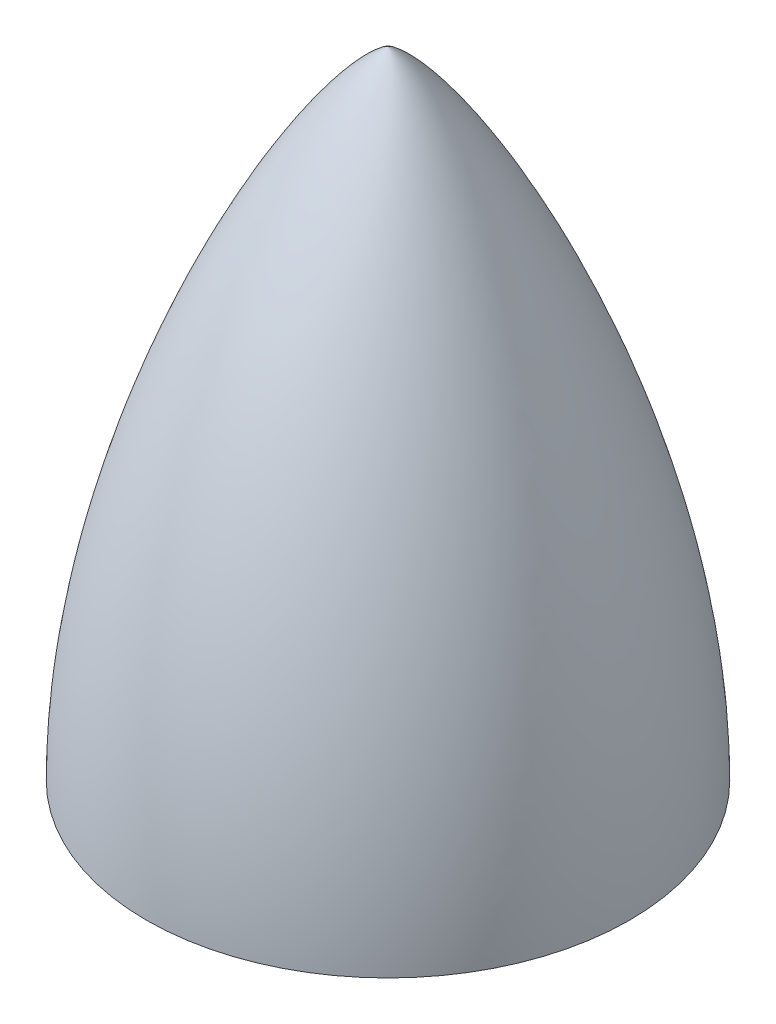
ISO-10303-21;
HEADER;
FILE_DESCRIPTION(('STEP AP214'),'2;1');
FILE_NAME('part.step','',(''),(''),'','','');
FILE_SCHEMA(('AUTOMOTIVE_DESIGN { 1 0 10303 214 1 1 1 1 }'));
ENDSEC;
DATA;
#1=APPLICATION_CONTEXT('core data for automotive mechanical design processes');
#2=APPLICATION_PROTOCOL_DEFINITION('international standard','automotive_design',2000,#1);
#3=PRODUCT_CONTEXT('',#1,'mechanical');
#4=PRODUCT('Part','Part','',(#3));
#5=PRODUCT_RELATED_PRODUCT_CATEGORY('part','',(#4));
#6=PRODUCT_DEFINITION_FORMATION('','',#4);
#7=PRODUCT_DEFINITION_CONTEXT('part definition',#1,'design');
#8=PRODUCT_DEFINITION('design','',#6,#7);
#9=PRODUCT_DEFINITION_SHAPE('','',#8);
#10=(LENGTH_UNIT() NAMED_UNIT(*) SI_UNIT(.MILLI.,.METRE.));
#11=(NAMED_UNIT(*) PLANE_ANGLE_UNIT() SI_UNIT($,.RADIAN.));
#12=(NAMED_UNIT(*) SI_UNIT($,.STERADIAN.) SOLID_ANGLE_UNIT());
#13=UNCERTAINTY_MEASURE_WITH_UNIT(LENGTH_MEASURE(1.E-05),#10,'distance_accuracy_value','');
#14=(GEOMETRIC_REPRESENTATION_CONTEXT(3) GLOBAL_UNCERTAINTY_ASSIGNED_CONTEXT((#13)) GLOBAL_UNIT_ASSIGNED_CONTEXT((#10,
#11,#12)) REPRESENTATION_CONTEXT('',''));
#15=CARTESIAN_POINT('',(0.,0.,0.));
#16=DIRECTION('',(0.,0.,1.));
#17=DIRECTION('',(1.,0.,0.));
#18=AXIS2_PLACEMENT_3D('',#15,#16,#17);
#19=CARTESIAN_POINT('',(0.,220.,0.));
#20=DIRECTION('',(0.,-1.,0.));
#21=DIRECTION('',(0.,0.,-1.));
#22=AXIS2_PLACEMENT_3D('',#19,#20,#21);
#23=PLANE('',#22);
#24=CARTESIAN_POINT('',(-34.,220.,-13.));
#25=DIRECTION('',(0.,-1.,0.));
#26=DIRECTION('',(0.,0.,-1.));
#27=AXIS2_PLACEMENT_3D('',#24,#25,#26);
#28=CIRCLE('',#27,0.825000000000001);
#29=CARTESIAN_POINT('',(-34.,220.,-13.825));
#30=VERTEX_POINT('',#29);
#31=EDGE_CURVE('E233',#30,#30,#28,.T.);
#32=ORIENTED_EDGE('',*,*,#31,.F.);
#33=EDGE_LOOP('',(#32));
#34=FACE_BOUND('',#33,.T.);
#35=CARTESIAN_POINT('',(33.,220.,-13.));
#36=DIRECTION('',(0.,-1.,0.));
#37=DIRECTION('',(0.,0.,-1.));
#38=AXIS2_PLACEMENT_3D('',#35,#36,#37);
#39=CIRCLE('',#38,0.825000000000008);
#40=CARTESIAN_POINT('',(33.,220.,-13.825));
#41=VERTEX_POINT('',#40);
#42=EDGE_CURVE('E211',#41,#41,#39,.T.);
#43=ORIENTED_EDGE('',*,*,#42,.F.);
#44=EDGE_LOOP('',(#43));
#45=FACE_BOUND('',#44,.T.);
#46=CARTESIAN_POINT('',(0.,220.,0.));
#47=DIRECTION('',(0.,-1.,0.));
#48=DIRECTION('',(0.,0.,-1.));
#49=AXIS2_PLACEMENT_3D('',#46,#47,#48);
#50=CIRCLE('',#49,38.);
#51=CARTESIAN_POINT('',(0.,220.,-38.));
#52=VERTEX_POINT('',#51);
#53=EDGE_CURVE('E11',#52,#52,#50,.T.);
#54=ORIENTED_EDGE('',*,*,#53,.T.);
#55=EDGE_LOOP('',(#54));
#56=FACE_BOUND('',#55,.T.);
#57=DIRECTION('',(0.,0.,1.));
#58=VECTOR('',#57,1.);
#59=CARTESIAN_POINT('',(-11.75,220.,0.));
#60=LINE('',#59,#58);
#61=CARTESIAN_POINT('',(-11.75,220.,19.6050219461318));
#62=VERTEX_POINT('',#61);
#63=CARTESIAN_POINT('',(-11.75,220.,33.6050219461318));
#64=VERTEX_POINT('',#63);
#65=EDGE_CURVE('E181',#62,#64,#60,.T.);
#66=ORIENTED_EDGE('',*,*,#65,.T.);
#67=DIRECTION('',(1.,0.,0.));
#68=VECTOR('',#67,1.);
#69=CARTESIAN_POINT('',(0.,220.,33.6050219461318));
#70=LINE('',#69,#68);
#71=CARTESIAN_POINT('',(11.75,220.,33.6050219461318));
#72=VERTEX_POINT('',#71);
#73=EDGE_CURVE('E56',#64,#72,#70,.T.);
#74=ORIENTED_EDGE('',*,*,#73,.T.);
#75=DIRECTION('',(0.,0.,1.));
#76=VECTOR('',#75,1.);
#77=CARTESIAN_POINT('',(11.75,220.,0.));
#78=LINE('',#77,#76);
#79=CARTESIAN_POINT('',(11.75,220.,19.6050219461318));
#80=VERTEX_POINT('',#79);
#81=EDGE_CURVE('E151',#80,#72,#78,.T.);
#82=ORIENTED_EDGE('',*,*,#81,.F.);
#83=DIRECTION('',(1.,0.,0.));
#84=VECTOR('',#83,1.);
#85=CARTESIAN_POINT('',(0.,220.,19.6050219461318));
#86=LINE('',#85,#84);
#87=CARTESIAN_POINT('',(16.75,220.,19.6050219461318));
#88=VERTEX_POINT('',#87);
#89=EDGE_CURVE('E154',#80,#88,#86,.T.);
#90=ORIENTED_EDGE('',*,*,#89,.T.);
#91=DIRECTION('',(0.,0.,-1.));
#92=VECTOR('',#91,1.);
#93=CARTESIAN_POINT('',(16.75,220.,0.));
#94=LINE('',#93,#92);
#95=CARTESIAN_POINT('',(16.75,220.,14.6050219461318));
#96=VERTEX_POINT('',#95);
#97=EDGE_CURVE('E204',#88,#96,#94,.T.);
#98=ORIENTED_EDGE('',*,*,#97,.T.);
#99=DIRECTION('',(1.,0.,0.));
#100=VECTOR('',#99,1.);
#101=CARTESIAN_POINT('',(0.,220.,14.6050219461318));
#102=LINE('',#101,#100);
#103=CARTESIAN_POINT('',(11.75,220.,14.6050219461318));
#104=VERTEX_POINT('',#103);
#105=EDGE_CURVE('E201',#104,#96,#102,.T.);
#106=ORIENTED_EDGE('',*,*,#105,.F.);
#107=DIRECTION('',(0.,0.,-1.));
#108=VECTOR('',#107,1.);
#109=CARTESIAN_POINT('',(11.75,220.,0.));
#110=LINE('',#109,#108);
#111=CARTESIAN_POINT('',(11.75,220.,-2.39497805386819));
#112=VERTEX_POINT('',#111);
#113=EDGE_CURVE('E198',#104,#112,#110,.T.);
#114=ORIENTED_EDGE('',*,*,#113,.T.);
#115=DIRECTION('',(1.,0.,0.));
#116=VECTOR('',#115,1.);
#117=CARTESIAN_POINT('',(0.,220.,-2.39497805386819));
#118=LINE('',#117,#116);
#119=CARTESIAN_POINT('',(-11.75,220.,-2.39497805386819));
#120=VERTEX_POINT('',#119);
#121=EDGE_CURVE('E195',#120,#112,#118,.T.);
#122=ORIENTED_EDGE('',*,*,#121,.F.);
#123=DIRECTION('',(0.,0.,-1.));
#124=VECTOR('',#123,1.);
#125=CARTESIAN_POINT('',(-11.75,220.,0.));
#126=LINE('',#125,#124);
#127=CARTESIAN_POINT('',(-11.75,220.,14.6050219461318));
#128=VERTEX_POINT('',#127);
#129=EDGE_CURVE('E192',#128,#120,#126,.T.);
#130=ORIENTED_EDGE('',*,*,#129,.F.);
#131=DIRECTION('',(1.,0.,0.));
#132=VECTOR('',#131,1.);
#133=CARTESIAN_POINT('',(0.,220.,14.6050219461318));
#134=LINE('',#133,#132);
#135=CARTESIAN_POINT('',(-16.75,220.,14.6050219461318));
#136=VERTEX_POINT('',#135);
#137=EDGE_CURVE('E189',#136,#128,#134,.T.);
#138=ORIENTED_EDGE('',*,*,#137,.F.);
#139=DIRECTION('',(0.,0.,-1.));
#140=VECTOR('',#139,1.);
#141=CARTESIAN_POINT('',(-16.75,220.,0.));
#142=LINE('',#141,#140);
#143=CARTESIAN_POINT('',(-16.75,220.,19.6050219461318));
#144=VERTEX_POINT('',#143);
#145=EDGE_CURVE('E186',#144,#136,#142,.T.);
#146=ORIENTED_EDGE('',*,*,#145,.F.);
#147=DIRECTION('',(1.,0.,0.));
#148=VECTOR('',#147,1.);
#149=CARTESIAN_POINT('',(0.,220.,19.6050219461318));
#150=LINE('',#149,#148);
#151=EDGE_CURVE('E183',#144,#62,#150,.T.);
#152=ORIENTED_EDGE('',*,*,#151,.T.);
#153=EDGE_LOOP('',(#66,#74,#82,#90,#98,#106,#114,#122,#130,#138,#146,#152));
#154=FACE_BOUND('',#153,.T.);
#155=ADVANCED_FACE('F41',(#34,#45,#56,#154),#23,.T.);
#156=CARTESIAN_POINT('',(0.,320.,0.));
#157=CARTESIAN_POINT('',(11.207798148571,313.529174721899,0.));
#158=CARTESIAN_POINT('',(38.,264.553067297862,0.));
#159=CARTESIAN_POINT('',(38.,220.,0.));
#160=B_SPLINE_CURVE_WITH_KNOTS('',3,(#156,#157,#158,#159),.UNSPECIFIED.,.F.,.F.,(4,4),(0.,1.),.UNSPECIFIED.);
#161=CARTESIAN_POINT('',(0.,220.,0.));
#162=DIRECTION('',(0.,-1.,0.));
#163=AXIS1_PLACEMENT('',#161,#162);
#164=SURFACE_OF_REVOLUTION('',#160,#163);
#165=ORIENTED_EDGE('',*,*,#53,.F.);
#166=EDGE_LOOP('',(#165));
#167=FACE_BOUND('',#166,.T.);
#168=CARTESIAN_POINT('',(0.,320.,0.));
#169=VERTEX_POINT('',#168);
#170=VERTEX_LOOP('',#169);
#171=FACE_BOUND('',#170,.T.);
#172=ADVANCED_FACE('F43',(#167,#171),#164,.T.);
#173=CARTESIAN_POINT('',(33.,230.,-13.));
#174=DIRECTION('',(0.,-1.,0.));
#175=DIRECTION('',(0.,0.,-1.));
#176=AXIS2_PLACEMENT_3D('',#173,#174,#175);
#177=CYLINDRICAL_SURFACE('',#176,0.825000000000008);
#178=CARTESIAN_POINT('',(33.,230.,-13.));
#179=DIRECTION('',(0.,-1.,0.));
#180=DIRECTION('',(0.,0.,-1.));
#181=AXIS2_PLACEMENT_3D('',#178,#179,#180);
#182=CIRCLE('',#181,0.825000000000008);
#183=CARTESIAN_POINT('',(33.,230.,-13.825));
#184=VERTEX_POINT('',#183);
#185=EDGE_CURVE('E236',#184,#184,#182,.T.);
#186=ORIENTED_EDGE('',*,*,#185,.F.);
#187=EDGE_LOOP('',(#186));
#188=FACE_BOUND('',#187,.T.);
#189=ORIENTED_EDGE('',*,*,#42,.T.);
#190=EDGE_LOOP('',(#189));
#191=FACE_BOUND('',#190,.T.);
#192=ADVANCED_FACE('F248',(#188,#191),#177,.F.);
#193=CARTESIAN_POINT('',(0.,230.,0.));
#194=DIRECTION('',(0.,-1.,0.));
#195=DIRECTION('',(0.,0.,-1.));
#196=AXIS2_PLACEMENT_3D('',#193,#194,#195);
#197=PLANE('',#196);
#198=ORIENTED_EDGE('',*,*,#185,.T.);
#199=EDGE_LOOP('',(#198));
#200=FACE_BOUND('',#199,.T.);
#201=ADVANCED_FACE('F330',(#200),#197,.T.);
#202=CARTESIAN_POINT('',(-34.,230.,-13.));
#203=DIRECTION('',(0.,-1.,0.));
#204=DIRECTION('',(0.,0.,-1.));
#205=AXIS2_PLACEMENT_3D('',#202,#203,#204);
#206=CYLINDRICAL_SURFACE('',#205,0.825000000000001);
#207=CARTESIAN_POINT('',(-34.,230.,-13.));
#208=DIRECTION('',(0.,-1.,0.));
#209=DIRECTION('',(0.,0.,-1.));
#210=AXIS2_PLACEMENT_3D('',#207,#208,#209);
#211=CIRCLE('',#210,0.825000000000001);
#212=CARTESIAN_POINT('',(-34.,230.,-13.825));
#213=VERTEX_POINT('',#212);
#214=EDGE_CURVE('E49',#213,#213,#211,.T.);
#215=ORIENTED_EDGE('',*,*,#214,.F.);
#216=EDGE_LOOP('',(#215));
#217=FACE_BOUND('',#216,.T.);
#218=ORIENTED_EDGE('',*,*,#31,.T.);
#219=EDGE_LOOP('',(#218));
#220=FACE_BOUND('',#219,.T.);
#221=ADVANCED_FACE('F326',(#217,#220),#206,.F.);
#222=CARTESIAN_POINT('',(0.,230.,0.));
#223=DIRECTION('',(0.,-1.,0.));
#224=DIRECTION('',(0.,0.,-1.));
#225=AXIS2_PLACEMENT_3D('',#222,#223,#224);
#226=PLANE('',#225);
#227=ORIENTED_EDGE('',*,*,#214,.T.);
#228=EDGE_LOOP('',(#227));
#229=FACE_BOUND('',#228,.T.);
#230=ADVANCED_FACE('F323',(#229),#226,.T.);
#231=CARTESIAN_POINT('',(0.,230.,33.6050219461318));
#232=DIRECTION('',(0.,0.,-1.));
#233=DIRECTION('',(-1.,0.,0.));
#234=AXIS2_PLACEMENT_3D('',#231,#232,#233);
#235=PLANE('',#234);
#236=ORIENTED_EDGE('',*,*,#73,.F.);
#237=DIRECTION('',(0.,-1.,0.));
#238=VECTOR('',#237,1.);
#239=CARTESIAN_POINT('',(-11.75,230.,33.6050219461318));
#240=LINE('',#239,#238);
#241=CARTESIAN_POINT('',(-11.75,230.,33.6050219461318));
#242=VERTEX_POINT('',#241);
#243=EDGE_CURVE('E134',#242,#64,#240,.T.);
#244=ORIENTED_EDGE('',*,*,#243,.F.);
#245=DIRECTION('',(1.,0.,0.));
#246=VECTOR('',#245,1.);
#247=CARTESIAN_POINT('',(0.,230.,33.6050219461318));
#248=LINE('',#247,#246);
#249=CARTESIAN_POINT('',(11.75,230.,33.6050219461318));
#250=VERTEX_POINT('',#249);
#251=EDGE_CURVE('E141',#242,#250,#248,.T.);
#252=ORIENTED_EDGE('',*,*,#251,.T.);
#253=DIRECTION('',(0.,-1.,0.));
#254=VECTOR('',#253,1.);
#255=CARTESIAN_POINT('',(11.75,230.,33.6050219461318));
#256=LINE('',#255,#254);
#257=EDGE_CURVE('E209',#250,#72,#256,.T.);
#258=ORIENTED_EDGE('',*,*,#257,.T.);
#259=EDGE_LOOP('',(#236,#244,#252,#258));
#260=FACE_BOUND('',#259,.T.);
#261=ADVANCED_FACE('F143',(#260),#235,.T.);
#262=CARTESIAN_POINT('',(11.75,230.,0.));
#263=DIRECTION('',(1.,0.,0.));
#264=DIRECTION('',(0.,0.,-1.));
#265=AXIS2_PLACEMENT_3D('',#262,#263,#264);
#266=PLANE('',#265);
#267=ORIENTED_EDGE('',*,*,#81,.T.);
#268=ORIENTED_EDGE('',*,*,#257,.F.);
#269=DIRECTION('',(0.,0.,1.));
#270=VECTOR('',#269,1.);
#271=CARTESIAN_POINT('',(11.75,230.,0.));
#272=LINE('',#271,#270);
#273=CARTESIAN_POINT('',(11.75,230.,19.6050219461318));
#274=VERTEX_POINT('',#273);
#275=EDGE_CURVE('E145',#274,#250,#272,.T.);
#276=ORIENTED_EDGE('',*,*,#275,.F.);
#277=DIRECTION('',(0.,-1.,0.));
#278=VECTOR('',#277,1.);
#279=CARTESIAN_POINT('',(11.75,230.,19.6050219461318));
#280=LINE('',#279,#278);
#281=EDGE_CURVE('E212',#274,#80,#280,.T.);
#282=ORIENTED_EDGE('',*,*,#281,.T.);
#283=EDGE_LOOP('',(#267,#268,#276,#282));
#284=FACE_BOUND('',#283,.T.);
#285=ADVANCED_FACE('F292',(#284),#266,.F.);
#286=CARTESIAN_POINT('',(0.,230.,19.6050219461318));
#287=DIRECTION('',(0.,0.,-1.));
#288=DIRECTION('',(-1.,0.,0.));
#289=AXIS2_PLACEMENT_3D('',#286,#287,#288);
#290=PLANE('',#289);
#291=ORIENTED_EDGE('',*,*,#89,.F.);
#292=ORIENTED_EDGE('',*,*,#281,.F.);
#293=DIRECTION('',(1.,0.,0.));
#294=VECTOR('',#293,1.);
#295=CARTESIAN_POINT('',(0.,230.,19.6050219461318));
#296=LINE('',#295,#294);
#297=CARTESIAN_POINT('',(16.75,230.,19.6050219461318));
#298=VERTEX_POINT('',#297);
#299=EDGE_CURVE('E177',#274,#298,#296,.T.);
#300=ORIENTED_EDGE('',*,*,#299,.T.);
#301=DIRECTION('',(0.,-1.,0.));
#302=VECTOR('',#301,1.);
#303=CARTESIAN_POINT('',(16.75,230.,19.6050219461318));
#304=LINE('',#303,#302);
#305=EDGE_CURVE('E214',#298,#88,#304,.T.);
#306=ORIENTED_EDGE('',*,*,#305,.T.);
#307=EDGE_LOOP('',(#291,#292,#300,#306));
#308=FACE_BOUND('',#307,.T.);
#309=ADVANCED_FACE('F294',(#308),#290,.T.);
#310=CARTESIAN_POINT('',(16.75,230.,0.));
#311=DIRECTION('',(-1.,0.,0.));
#312=DIRECTION('',(0.,0.,1.));
#313=AXIS2_PLACEMENT_3D('',#310,#311,#312);
#314=PLANE('',#313);
#315=ORIENTED_EDGE('',*,*,#97,.F.);
#316=ORIENTED_EDGE('',*,*,#305,.F.);
#317=DIRECTION('',(0.,0.,-1.));
#318=VECTOR('',#317,1.);
#319=CARTESIAN_POINT('',(16.75,230.,0.));
#320=LINE('',#319,#318);
#321=CARTESIAN_POINT('',(16.75,230.,14.6050219461318));
#322=VERTEX_POINT('',#321);
#323=EDGE_CURVE('E175',#298,#322,#320,.T.);
#324=ORIENTED_EDGE('',*,*,#323,.T.);
#325=DIRECTION('',(0.,-1.,0.));
#326=VECTOR('',#325,1.);
#327=CARTESIAN_POINT('',(16.75,230.,14.6050219461318));
#328=LINE('',#327,#326);
#329=EDGE_CURVE('E216',#322,#96,#328,.T.);
#330=ORIENTED_EDGE('',*,*,#329,.T.);
#331=EDGE_LOOP('',(#315,#316,#324,#330));
#332=FACE_BOUND('',#331,.T.);
#333=ADVANCED_FACE('F288',(#332),#314,.T.);
#334=CARTESIAN_POINT('',(0.,230.,14.6050219461318));
#335=DIRECTION('',(0.,0.,-1.));
#336=DIRECTION('',(-1.,0.,0.));
#337=AXIS2_PLACEMENT_3D('',#334,#335,#336);
#338=PLANE('',#337);
#339=ORIENTED_EDGE('',*,*,#105,.T.);
#340=ORIENTED_EDGE('',*,*,#329,.F.);
#341=DIRECTION('',(1.,0.,0.));
#342=VECTOR('',#341,1.);
#343=CARTESIAN_POINT('',(0.,230.,14.6050219461318));
#344=LINE('',#343,#342);
#345=CARTESIAN_POINT('',(11.75,230.,14.6050219461318));
#346=VERTEX_POINT('',#345);
#347=EDGE_CURVE('E172',#346,#322,#344,.T.);
#348=ORIENTED_EDGE('',*,*,#347,.F.);
#349=DIRECTION('',(0.,-1.,0.));
#350=VECTOR('',#349,1.);
#351=CARTESIAN_POINT('',(11.75,230.,14.6050219461318));
#352=LINE('',#351,#350);
#353=EDGE_CURVE('E218',#346,#104,#352,.T.);
#354=ORIENTED_EDGE('',*,*,#353,.T.);
#355=EDGE_LOOP('',(#339,#340,#348,#354));
#356=FACE_BOUND('',#355,.T.);
#357=ADVANCED_FACE('F285',(#356),#338,.F.);
#358=CARTESIAN_POINT('',(11.75,230.,0.));
#359=DIRECTION('',(-1.,0.,0.));
#360=DIRECTION('',(0.,0.,1.));
#361=AXIS2_PLACEMENT_3D('',#358,#359,#360);
#362=PLANE('',#361);
#363=ORIENTED_EDGE('',*,*,#113,.F.);
#364=ORIENTED_EDGE('',*,*,#353,.F.);
#365=DIRECTION('',(0.,0.,-1.));
#366=VECTOR('',#365,1.);
#367=CARTESIAN_POINT('',(11.75,230.,0.));
#368=LINE('',#367,#366);
#369=CARTESIAN_POINT('',(11.75,230.,-2.39497805386819));
#370=VERTEX_POINT('',#369);
#371=EDGE_CURVE('E170',#346,#370,#368,.T.);
#372=ORIENTED_EDGE('',*,*,#371,.T.);
#373=DIRECTION('',(0.,-1.,0.));
#374=VECTOR('',#373,1.);
#375=CARTESIAN_POINT('',(11.75,230.,-2.39497805386819));
#376=LINE('',#375,#374);
#377=EDGE_CURVE('E220',#370,#112,#376,.T.);
#378=ORIENTED_EDGE('',*,*,#377,.T.);
#379=EDGE_LOOP('',(#363,#364,#372,#378));
#380=FACE_BOUND('',#379,.T.);
#381=ADVANCED_FACE('F279',(#380),#362,.T.);
#382=CARTESIAN_POINT('',(0.,230.,-2.39497805386819));
#383=DIRECTION('',(0.,0.,-1.));
#384=DIRECTION('',(-1.,0.,0.));
#385=AXIS2_PLACEMENT_3D('',#382,#383,#384);
#386=PLANE('',#385);
#387=ORIENTED_EDGE('',*,*,#121,.T.);
#388=ORIENTED_EDGE('',*,*,#377,.F.);
#389=DIRECTION('',(1.,0.,0.));
#390=VECTOR('',#389,1.);
#391=CARTESIAN_POINT('',(0.,230.,-2.39497805386819));
#392=LINE('',#391,#390);
#393=CARTESIAN_POINT('',(-11.75,230.,-2.39497805386819));
#394=VERTEX_POINT('',#393);
#395=EDGE_CURVE('E167',#394,#370,#392,.T.);
#396=ORIENTED_EDGE('',*,*,#395,.F.);
#397=DIRECTION('',(0.,-1.,0.));
#398=VECTOR('',#397,1.);
#399=CARTESIAN_POINT('',(-11.75,230.,-2.39497805386819));
#400=LINE('',#399,#398);
#401=EDGE_CURVE('E222',#394,#120,#400,.T.);
#402=ORIENTED_EDGE('',*,*,#401,.T.);
#403=EDGE_LOOP('',(#387,#388,#396,#402));
#404=FACE_BOUND('',#403,.T.);
#405=ADVANCED_FACE('F276',(#404),#386,.F.);
#406=CARTESIAN_POINT('',(-11.75,230.,0.));
#407=DIRECTION('',(-1.,0.,0.));
#408=DIRECTION('',(0.,0.,1.));
#409=AXIS2_PLACEMENT_3D('',#406,#407,#408);
#410=PLANE('',#409);
#411=ORIENTED_EDGE('',*,*,#129,.T.);
#412=ORIENTED_EDGE('',*,*,#401,.F.);
#413=DIRECTION('',(0.,0.,-1.));
#414=VECTOR('',#413,1.);
#415=CARTESIAN_POINT('',(-11.75,230.,0.));
#416=LINE('',#415,#414);
#417=CARTESIAN_POINT('',(-11.75,230.,14.6050219461318));
#418=VERTEX_POINT('',#417);
#419=EDGE_CURVE('E164',#418,#394,#416,.T.);
#420=ORIENTED_EDGE('',*,*,#419,.F.);
#421=DIRECTION('',(0.,-1.,0.));
#422=VECTOR('',#421,1.);
#423=CARTESIAN_POINT('',(-11.75,230.,14.6050219461318));
#424=LINE('',#423,#422);
#425=EDGE_CURVE('E224',#418,#128,#424,.T.);
#426=ORIENTED_EDGE('',*,*,#425,.T.);
#427=EDGE_LOOP('',(#411,#412,#420,#426));
#428=FACE_BOUND('',#427,.T.);
#429=ADVANCED_FACE('F271',(#428),#410,.F.);
#430=CARTESIAN_POINT('',(0.,230.,14.6050219461318));
#431=DIRECTION('',(0.,0.,-1.));
#432=DIRECTION('',(-1.,0.,0.));
#433=AXIS2_PLACEMENT_3D('',#430,#431,#432);
#434=PLANE('',#433);
#435=ORIENTED_EDGE('',*,*,#137,.T.);
#436=ORIENTED_EDGE('',*,*,#425,.F.);
#437=DIRECTION('',(1.,0.,0.));
#438=VECTOR('',#437,1.);
#439=CARTESIAN_POINT('',(0.,230.,14.6050219461318));
#440=LINE('',#439,#438);
#441=CARTESIAN_POINT('',(-16.75,230.,14.6050219461318));
#442=VERTEX_POINT('',#441);
#443=EDGE_CURVE('E161',#442,#418,#440,.T.);
#444=ORIENTED_EDGE('',*,*,#443,.F.);
#445=DIRECTION('',(0.,-1.,0.));
#446=VECTOR('',#445,1.);
#447=CARTESIAN_POINT('',(-16.75,230.,14.6050219461318));
#448=LINE('',#447,#446);
#449=EDGE_CURVE('E226',#442,#136,#448,.T.);
#450=ORIENTED_EDGE('',*,*,#449,.T.);
#451=EDGE_LOOP('',(#435,#436,#444,#450));
#452=FACE_BOUND('',#451,.T.);
#453=ADVANCED_FACE('F266',(#452),#434,.F.);
#454=CARTESIAN_POINT('',(-16.75,230.,0.));
#455=DIRECTION('',(-1.,0.,0.));
#456=DIRECTION('',(0.,0.,1.));
#457=AXIS2_PLACEMENT_3D('',#454,#455,#456);
#458=PLANE('',#457);
#459=ORIENTED_EDGE('',*,*,#145,.T.);
#460=ORIENTED_EDGE('',*,*,#449,.F.);
#461=DIRECTION('',(0.,0.,-1.));
#462=VECTOR('',#461,1.);
#463=CARTESIAN_POINT('',(-16.75,230.,0.));
#464=LINE('',#463,#462);
#465=CARTESIAN_POINT('',(-16.75,230.,19.6050219461318));
#466=VERTEX_POINT('',#465);
#467=EDGE_CURVE('E158',#466,#442,#464,.T.);
#468=ORIENTED_EDGE('',*,*,#467,.F.);
#469=DIRECTION('',(0.,-1.,0.));
#470=VECTOR('',#469,1.);
#471=CARTESIAN_POINT('',(-16.75,230.,19.6050219461318));
#472=LINE('',#471,#470);
#473=EDGE_CURVE('E228',#466,#144,#472,.T.);
#474=ORIENTED_EDGE('',*,*,#473,.T.);
#475=EDGE_LOOP('',(#459,#460,#468,#474));
#476=FACE_BOUND('',#475,.T.);
#477=ADVANCED_FACE('F263',(#476),#458,.F.);
#478=CARTESIAN_POINT('',(0.,230.,19.6050219461318));
#479=DIRECTION('',(0.,0.,-1.));
#480=DIRECTION('',(-1.,0.,0.));
#481=AXIS2_PLACEMENT_3D('',#478,#479,#480);
#482=PLANE('',#481);
#483=ORIENTED_EDGE('',*,*,#151,.F.);
#484=ORIENTED_EDGE('',*,*,#473,.F.);
#485=DIRECTION('',(1.,0.,0.));
#486=VECTOR('',#485,1.);
#487=CARTESIAN_POINT('',(0.,230.,19.6050219461318));
#488=LINE('',#487,#486);
#489=CARTESIAN_POINT('',(-11.75,230.,19.6050219461318));
#490=VERTEX_POINT('',#489);
#491=EDGE_CURVE('E140',#466,#490,#488,.T.);
#492=ORIENTED_EDGE('',*,*,#491,.T.);
#493=DIRECTION('',(0.,-1.,0.));
#494=VECTOR('',#493,1.);
#495=CARTESIAN_POINT('',(-11.75,230.,19.6050219461318));
#496=LINE('',#495,#494);
#497=EDGE_CURVE('E136',#490,#62,#496,.T.);
#498=ORIENTED_EDGE('',*,*,#497,.T.);
#499=EDGE_LOOP('',(#483,#484,#492,#498));
#500=FACE_BOUND('',#499,.T.);
#501=ADVANCED_FACE('F260',(#500),#482,.T.);
#502=CARTESIAN_POINT('',(-11.75,230.,0.));
#503=DIRECTION('',(1.,0.,0.));
#504=DIRECTION('',(0.,0.,-1.));
#505=AXIS2_PLACEMENT_3D('',#502,#503,#504);
#506=PLANE('',#505);
#507=ORIENTED_EDGE('',*,*,#65,.F.);
#508=ORIENTED_EDGE('',*,*,#497,.F.);
#509=DIRECTION('',(0.,0.,1.));
#510=VECTOR('',#509,1.);
#511=CARTESIAN_POINT('',(-11.75,230.,0.));
#512=LINE('',#511,#510);
#513=EDGE_CURVE('E131',#490,#242,#512,.T.);
#514=ORIENTED_EDGE('',*,*,#513,.T.);
#515=ORIENTED_EDGE('',*,*,#243,.T.);
#516=EDGE_LOOP('',(#507,#508,#514,#515));
#517=FACE_BOUND('',#516,.T.);
#518=ADVANCED_FACE('F133',(#517),#506,.T.);
#519=CARTESIAN_POINT('',(0.,230.,0.));
#520=DIRECTION('',(0.,-1.,0.));
#521=DIRECTION('',(0.,0.,-1.));
#522=AXIS2_PLACEMENT_3D('',#519,#520,#521);
#523=PLANE('',#522);
#524=ORIENTED_EDGE('',*,*,#251,.F.);
#525=ORIENTED_EDGE('',*,*,#513,.F.);
#526=ORIENTED_EDGE('',*,*,#491,.F.);
#527=ORIENTED_EDGE('',*,*,#467,.T.);
#528=ORIENTED_EDGE('',*,*,#443,.T.);
#529=ORIENTED_EDGE('',*,*,#419,.T.);
#530=ORIENTED_EDGE('',*,*,#395,.T.);
#531=ORIENTED_EDGE('',*,*,#371,.F.);
#532=ORIENTED_EDGE('',*,*,#347,.T.);
#533=ORIENTED_EDGE('',*,*,#323,.F.);
#534=ORIENTED_EDGE('',*,*,#299,.F.);
#535=ORIENTED_EDGE('',*,*,#275,.T.);
#536=EDGE_LOOP('',(#524,#525,#526,#527,#528,#529,#530,#531,#532,#533,#534,#535));
#537=FACE_BOUND('',#536,.T.);
#538=ADVANCED_FACE('F148',(#537),#523,.T.);
#539=CLOSED_SHELL('',(#155,#172,#192,#201,#221,#230,#261,#285,#309,#333,#357,#381,#405,#429,
#453,#477,#501,#518,#538));
#540=MANIFOLD_SOLID_BREP('B2',#539);
#541=ADVANCED_BREP_SHAPE_REPRESENTATION('',(#18,#540),#14);
#542=SHAPE_DEFINITION_REPRESENTATION(#9,#541);
ENDSEC;
END-ISO-10303-21;
